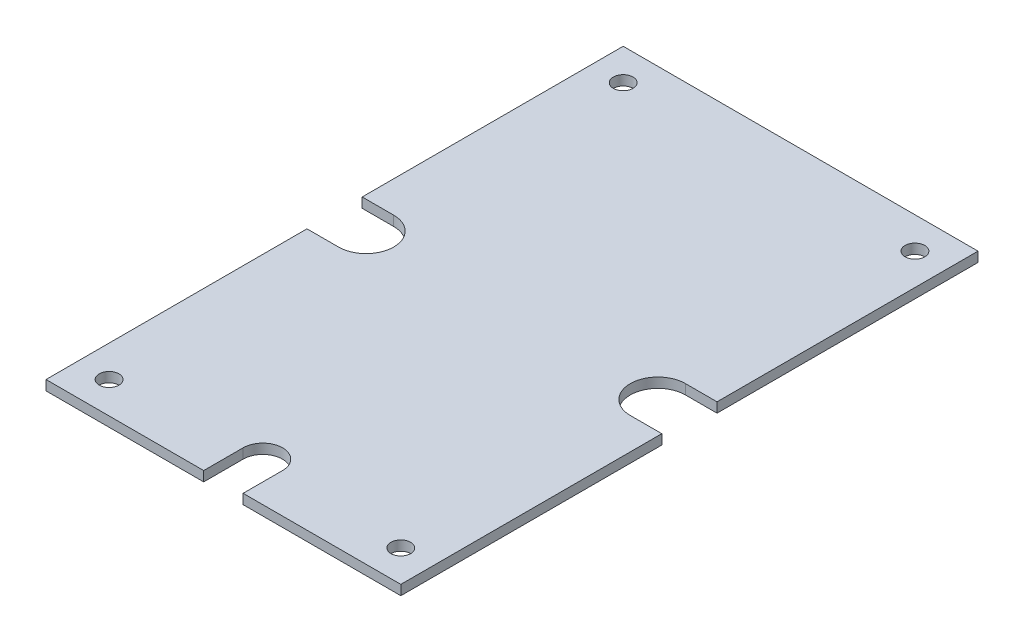
ISO-10303-21;
HEADER;
FILE_DESCRIPTION(('STEP AP214'),'2;1');
FILE_NAME('part.step','',(''),(''),'','','');
FILE_SCHEMA(('AUTOMOTIVE_DESIGN { 1 0 10303 214 1 1 1 1 }'));
ENDSEC;
DATA;
#1=APPLICATION_CONTEXT('core data for automotive mechanical design processes');
#2=APPLICATION_PROTOCOL_DEFINITION('international standard','automotive_design',2000,#1);
#3=PRODUCT_CONTEXT('',#1,'mechanical');
#4=PRODUCT('Part','Part','',(#3));
#5=PRODUCT_RELATED_PRODUCT_CATEGORY('part','',(#4));
#6=PRODUCT_DEFINITION_FORMATION('','',#4);
#7=PRODUCT_DEFINITION_CONTEXT('part definition',#1,'design');
#8=PRODUCT_DEFINITION('design','',#6,#7);
#9=PRODUCT_DEFINITION_SHAPE('','',#8);
#10=(LENGTH_UNIT() NAMED_UNIT(*) SI_UNIT(.MILLI.,.METRE.));
#11=(NAMED_UNIT(*) PLANE_ANGLE_UNIT() SI_UNIT($,.RADIAN.));
#12=(NAMED_UNIT(*) SI_UNIT($,.STERADIAN.) SOLID_ANGLE_UNIT());
#13=UNCERTAINTY_MEASURE_WITH_UNIT(LENGTH_MEASURE(1.E-05),#10,'distance_accuracy_value','');
#14=(GEOMETRIC_REPRESENTATION_CONTEXT(3) GLOBAL_UNCERTAINTY_ASSIGNED_CONTEXT((#13)) GLOBAL_UNIT_ASSIGNED_CONTEXT((#10,
#11,#12)) REPRESENTATION_CONTEXT('',''));
#15=CARTESIAN_POINT('',(0.,0.,0.));
#16=DIRECTION('',(0.,0.,1.));
#17=DIRECTION('',(1.,0.,0.));
#18=AXIS2_PLACEMENT_3D('',#15,#16,#17);
#19=CARTESIAN_POINT('',(0.,1.5875,0.));
#20=DIRECTION('',(0.,-1.,0.));
#21=DIRECTION('',(0.,0.,-1.));
#22=AXIS2_PLACEMENT_3D('',#19,#20,#21);
#23=PLANE('',#22);
#24=CARTESIAN_POINT('',(52.07,1.5875,-87.884));
#25=DIRECTION('',(0.,1.,0.));
#26=DIRECTION('',(0.,0.,1.));
#27=AXIS2_PLACEMENT_3D('',#24,#25,#26);
#28=CIRCLE('',#27,1.5875);
#29=CARTESIAN_POINT('',(52.07,1.5875,-86.2965));
#30=VERTEX_POINT('',#29);
#31=EDGE_CURVE('E259',#30,#30,#28,.T.);
#32=ORIENTED_EDGE('',*,*,#31,.F.);
#33=EDGE_LOOP('',(#32));
#34=FACE_BOUND('',#33,.T.);
#35=CARTESIAN_POINT('',(5.08,1.5875,-5.08));
#36=DIRECTION('',(0.,1.,0.));
#37=DIRECTION('',(0.,0.,1.));
#38=AXIS2_PLACEMENT_3D('',#35,#36,#37);
#39=CIRCLE('',#38,1.5875);
#40=CARTESIAN_POINT('',(5.08,1.5875,-3.4925));
#41=VERTEX_POINT('',#40);
#42=EDGE_CURVE('E266',#41,#41,#39,.T.);
#43=ORIENTED_EDGE('',*,*,#42,.F.);
#44=EDGE_LOOP('',(#43));
#45=FACE_BOUND('',#44,.T.);
#46=CARTESIAN_POINT('',(52.07,1.5875,-5.08000000000002));
#47=DIRECTION('',(0.,1.,0.));
#48=DIRECTION('',(0.,0.,1.));
#49=AXIS2_PLACEMENT_3D('',#46,#47,#48);
#50=CIRCLE('',#49,1.5875);
#51=CARTESIAN_POINT('',(52.07,1.5875,-3.49250000000002));
#52=VERTEX_POINT('',#51);
#53=EDGE_CURVE('E253',#52,#52,#50,.T.);
#54=ORIENTED_EDGE('',*,*,#53,.F.);
#55=EDGE_LOOP('',(#54));
#56=FACE_BOUND('',#55,.T.);
#57=CARTESIAN_POINT('',(5.07999999999997,1.5875,-87.884));
#58=DIRECTION('',(0.,1.,0.));
#59=DIRECTION('',(0.,0.,1.));
#60=AXIS2_PLACEMENT_3D('',#57,#58,#59);
#61=CIRCLE('',#60,1.5875);
#62=CARTESIAN_POINT('',(5.07999999999997,1.5875,-86.2965));
#63=VERTEX_POINT('',#62);
#64=EDGE_CURVE('E262',#63,#63,#61,.T.);
#65=ORIENTED_EDGE('',*,*,#64,.F.);
#66=EDGE_LOOP('',(#65));
#67=FACE_BOUND('',#66,.T.);
#68=DIRECTION('',(0.,0.,-1.));
#69=VECTOR('',#68,1.);
#70=CARTESIAN_POINT('',(25.4,1.5875,0.));
#71=LINE('',#70,#69);
#72=CARTESIAN_POINT('',(25.4,1.5875,0.));
#73=VERTEX_POINT('',#72);
#74=CARTESIAN_POINT('',(25.4,1.5875,-6.35));
#75=VERTEX_POINT('',#74);
#76=EDGE_CURVE('E152',#73,#75,#71,.T.);
#77=ORIENTED_EDGE('',*,*,#76,.T.);
#78=CARTESIAN_POINT('',(28.575,1.5875,-6.35));
#79=DIRECTION('',(0.,1.,0.));
#80=DIRECTION('',(0.,0.,1.));
#81=AXIS2_PLACEMENT_3D('',#78,#79,#80);
#82=CIRCLE('',#81,3.17500000000001);
#83=CARTESIAN_POINT('',(31.75,1.5875,-6.35));
#84=VERTEX_POINT('',#83);
#85=EDGE_CURVE('E158',#84,#75,#82,.T.);
#86=ORIENTED_EDGE('',*,*,#85,.F.);
#87=DIRECTION('',(0.,0.,1.));
#88=VECTOR('',#87,1.);
#89=CARTESIAN_POINT('',(31.75,1.5875,0.));
#90=LINE('',#89,#88);
#91=CARTESIAN_POINT('',(31.75,1.5875,0.));
#92=VERTEX_POINT('',#91);
#93=EDGE_CURVE('E526',#84,#92,#90,.T.);
#94=ORIENTED_EDGE('',*,*,#93,.T.);
#95=DIRECTION('',(1.,0.,0.));
#96=VECTOR('',#95,1.);
#97=CARTESIAN_POINT('',(0.,1.5875,0.));
#98=LINE('',#97,#96);
#99=CARTESIAN_POINT('',(57.15,1.5875,0.));
#100=VERTEX_POINT('',#99);
#101=EDGE_CURVE('E280',#92,#100,#98,.T.);
#102=ORIENTED_EDGE('',*,*,#101,.T.);
#103=DIRECTION('',(0.,0.,-1.));
#104=VECTOR('',#103,1.);
#105=CARTESIAN_POINT('',(57.15,1.5875,0.));
#106=LINE('',#105,#104);
#107=CARTESIAN_POINT('',(57.15,1.5875,-42.037));
#108=VERTEX_POINT('',#107);
#109=EDGE_CURVE('E197',#100,#108,#106,.T.);
#110=ORIENTED_EDGE('',*,*,#109,.T.);
#111=DIRECTION('',(1.,0.,0.));
#112=VECTOR('',#111,1.);
#113=CARTESIAN_POINT('',(0.,1.5875,-42.037));
#114=LINE('',#113,#112);
#115=CARTESIAN_POINT('',(52.07,1.5875,-42.037));
#116=VERTEX_POINT('',#115);
#117=EDGE_CURVE('E220',#116,#108,#114,.T.);
#118=ORIENTED_EDGE('',*,*,#117,.F.);
#119=CARTESIAN_POINT('',(52.07,1.5875,-46.482));
#120=DIRECTION('',(0.,1.,0.));
#121=DIRECTION('',(0.,0.,1.));
#122=AXIS2_PLACEMENT_3D('',#119,#120,#121);
#123=CIRCLE('',#122,4.445);
#124=CARTESIAN_POINT('',(52.07,1.5875,-50.927));
#125=VERTEX_POINT('',#124);
#126=EDGE_CURVE('E216',#125,#116,#123,.T.);
#127=ORIENTED_EDGE('',*,*,#126,.F.);
#128=DIRECTION('',(-1.,0.,0.));
#129=VECTOR('',#128,1.);
#130=CARTESIAN_POINT('',(0.,1.5875,-50.927));
#131=LINE('',#130,#129);
#132=CARTESIAN_POINT('',(57.15,1.5875,-50.927));
#133=VERTEX_POINT('',#132);
#134=EDGE_CURVE('E213',#133,#125,#131,.T.);
#135=ORIENTED_EDGE('',*,*,#134,.F.);
#136=CARTESIAN_POINT('',(57.15,1.5875,-92.964));
#137=VERTEX_POINT('',#136);
#138=EDGE_CURVE('E283',#133,#137,#106,.T.);
#139=ORIENTED_EDGE('',*,*,#138,.T.);
#140=DIRECTION('',(-1.,0.,0.));
#141=VECTOR('',#140,1.);
#142=CARTESIAN_POINT('',(0.,1.5875,-92.964));
#143=LINE('',#142,#141);
#144=CARTESIAN_POINT('',(0.,1.5875,-92.964));
#145=VERTEX_POINT('',#144);
#146=EDGE_CURVE('E187',#137,#145,#143,.T.);
#147=ORIENTED_EDGE('',*,*,#146,.T.);
#148=DIRECTION('',(0.,0.,1.));
#149=VECTOR('',#148,1.);
#150=CARTESIAN_POINT('',(0.,1.5875,0.));
#151=LINE('',#150,#149);
#152=CARTESIAN_POINT('',(0.,1.5875,-50.927));
#153=VERTEX_POINT('',#152);
#154=EDGE_CURVE('E277',#145,#153,#151,.T.);
#155=ORIENTED_EDGE('',*,*,#154,.T.);
#156=DIRECTION('',(1.,0.,0.));
#157=VECTOR('',#156,1.);
#158=CARTESIAN_POINT('',(0.,1.5875,-50.927));
#159=LINE('',#158,#157);
#160=CARTESIAN_POINT('',(5.08,1.5875,-50.927));
#161=VERTEX_POINT('',#160);
#162=EDGE_CURVE('E239',#153,#161,#159,.T.);
#163=ORIENTED_EDGE('',*,*,#162,.T.);
#164=CARTESIAN_POINT('',(5.08,1.5875,-46.482));
#165=DIRECTION('',(0.,1.,0.));
#166=DIRECTION('',(0.,0.,1.));
#167=AXIS2_PLACEMENT_3D('',#164,#165,#166);
#168=CIRCLE('',#167,4.445);
#169=CARTESIAN_POINT('',(5.08,1.5875,-42.037));
#170=VERTEX_POINT('',#169);
#171=EDGE_CURVE('E236',#161,#170,#168,.F.);
#172=ORIENTED_EDGE('',*,*,#171,.T.);
#173=DIRECTION('',(-1.,0.,0.));
#174=VECTOR('',#173,1.);
#175=CARTESIAN_POINT('',(0.,1.5875,-42.037));
#176=LINE('',#175,#174);
#177=CARTESIAN_POINT('',(0.,1.5875,-42.037));
#178=VERTEX_POINT('',#177);
#179=EDGE_CURVE('E231',#170,#178,#176,.T.);
#180=ORIENTED_EDGE('',*,*,#179,.T.);
#181=CARTESIAN_POINT('',(0.,1.5875,0.));
#182=VERTEX_POINT('',#181);
#183=EDGE_CURVE('E182',#178,#182,#151,.T.);
#184=ORIENTED_EDGE('',*,*,#183,.T.);
#185=EDGE_CURVE('E281',#182,#73,#98,.T.);
#186=ORIENTED_EDGE('',*,*,#185,.T.);
#187=EDGE_LOOP('',(#77,#86,#94,#102,#110,#118,#127,#135,#139,#147,#155,#163,#172,#180,#184,#186));
#188=FACE_BOUND('',#187,.T.);
#189=ADVANCED_FACE('F33',(#34,#45,#56,#67,#188),#23,.F.);
#190=CARTESIAN_POINT('',(0.,0.,0.));
#191=DIRECTION('',(0.,-1.,0.));
#192=DIRECTION('',(0.,0.,-1.));
#193=AXIS2_PLACEMENT_3D('',#190,#191,#192);
#194=PLANE('',#193);
#195=CARTESIAN_POINT('',(52.07,0.,-87.884));
#196=DIRECTION('',(0.,1.,0.));
#197=DIRECTION('',(0.,0.,1.));
#198=AXIS2_PLACEMENT_3D('',#195,#196,#197);
#199=CIRCLE('',#198,1.5875);
#200=CARTESIAN_POINT('',(52.07,0.,-86.2965));
#201=VERTEX_POINT('',#200);
#202=EDGE_CURVE('E263',#201,#201,#199,.T.);
#203=ORIENTED_EDGE('',*,*,#202,.T.);
#204=EDGE_LOOP('',(#203));
#205=FACE_BOUND('',#204,.T.);
#206=CARTESIAN_POINT('',(5.08,0.,-5.08));
#207=DIRECTION('',(0.,1.,0.));
#208=DIRECTION('',(0.,0.,1.));
#209=AXIS2_PLACEMENT_3D('',#206,#207,#208);
#210=CIRCLE('',#209,1.5875);
#211=CARTESIAN_POINT('',(5.08,0.,-3.4925));
#212=VERTEX_POINT('',#211);
#213=EDGE_CURVE('E256',#212,#212,#210,.T.);
#214=ORIENTED_EDGE('',*,*,#213,.T.);
#215=EDGE_LOOP('',(#214));
#216=FACE_BOUND('',#215,.T.);
#217=CARTESIAN_POINT('',(52.07,0.,-5.08000000000002));
#218=DIRECTION('',(0.,1.,0.));
#219=DIRECTION('',(0.,0.,1.));
#220=AXIS2_PLACEMENT_3D('',#217,#218,#219);
#221=CIRCLE('',#220,1.5875);
#222=CARTESIAN_POINT('',(52.07,0.,-3.49250000000002));
#223=VERTEX_POINT('',#222);
#224=EDGE_CURVE('E224',#223,#223,#221,.T.);
#225=ORIENTED_EDGE('',*,*,#224,.T.);
#226=EDGE_LOOP('',(#225));
#227=FACE_BOUND('',#226,.T.);
#228=CARTESIAN_POINT('',(5.07999999999997,0.,-87.884));
#229=DIRECTION('',(0.,1.,0.));
#230=DIRECTION('',(0.,0.,1.));
#231=AXIS2_PLACEMENT_3D('',#228,#229,#230);
#232=CIRCLE('',#231,1.5875);
#233=CARTESIAN_POINT('',(5.07999999999997,0.,-86.2965));
#234=VERTEX_POINT('',#233);
#235=EDGE_CURVE('E271',#234,#234,#232,.T.);
#236=ORIENTED_EDGE('',*,*,#235,.T.);
#237=EDGE_LOOP('',(#236));
#238=FACE_BOUND('',#237,.T.);
#239=CARTESIAN_POINT('',(28.575,0.,-6.35));
#240=DIRECTION('',(0.,-1.,0.));
#241=DIRECTION('',(0.,0.,-1.));
#242=AXIS2_PLACEMENT_3D('',#239,#240,#241);
#243=CIRCLE('',#242,3.17500000000001);
#244=CARTESIAN_POINT('',(31.75,0.,-6.35));
#245=VERTEX_POINT('',#244);
#246=CARTESIAN_POINT('',(25.4,0.,-6.35));
#247=VERTEX_POINT('',#246);
#248=EDGE_CURVE('E166',#245,#247,#243,.F.);
#249=ORIENTED_EDGE('',*,*,#248,.T.);
#250=DIRECTION('',(0.,0.,-1.));
#251=VECTOR('',#250,1.);
#252=CARTESIAN_POINT('',(25.4,0.,0.));
#253=LINE('',#252,#251);
#254=CARTESIAN_POINT('',(25.4,0.,0.));
#255=VERTEX_POINT('',#254);
#256=EDGE_CURVE('E149',#255,#247,#253,.T.);
#257=ORIENTED_EDGE('',*,*,#256,.F.);
#258=DIRECTION('',(1.,0.,0.));
#259=VECTOR('',#258,1.);
#260=CARTESIAN_POINT('',(0.,0.,0.));
#261=LINE('',#260,#259);
#262=CARTESIAN_POINT('',(0.,0.,0.));
#263=VERTEX_POINT('',#262);
#264=EDGE_CURVE('E165',#263,#255,#261,.T.);
#265=ORIENTED_EDGE('',*,*,#264,.F.);
#266=DIRECTION('',(0.,0.,1.));
#267=VECTOR('',#266,1.);
#268=CARTESIAN_POINT('',(0.,0.,0.));
#269=LINE('',#268,#267);
#270=CARTESIAN_POINT('',(0.,0.,-42.037));
#271=VERTEX_POINT('',#270);
#272=EDGE_CURVE('E274',#271,#263,#269,.T.);
#273=ORIENTED_EDGE('',*,*,#272,.F.);
#274=DIRECTION('',(-1.,0.,0.));
#275=VECTOR('',#274,1.);
#276=CARTESIAN_POINT('',(0.,0.,-42.037));
#277=LINE('',#276,#275);
#278=CARTESIAN_POINT('',(5.08,0.,-42.037));
#279=VERTEX_POINT('',#278);
#280=EDGE_CURVE('E233',#279,#271,#277,.T.);
#281=ORIENTED_EDGE('',*,*,#280,.F.);
#282=CARTESIAN_POINT('',(5.08,0.,-46.482));
#283=DIRECTION('',(0.,1.,0.));
#284=DIRECTION('',(0.,0.,1.));
#285=AXIS2_PLACEMENT_3D('',#282,#283,#284);
#286=CIRCLE('',#285,4.445);
#287=CARTESIAN_POINT('',(5.08,0.,-50.927));
#288=VERTEX_POINT('',#287);
#289=EDGE_CURVE('E228',#288,#279,#286,.F.);
#290=ORIENTED_EDGE('',*,*,#289,.F.);
#291=DIRECTION('',(1.,0.,0.));
#292=VECTOR('',#291,1.);
#293=CARTESIAN_POINT('',(0.,0.,-50.927));
#294=LINE('',#293,#292);
#295=CARTESIAN_POINT('',(0.,0.,-50.927));
#296=VERTEX_POINT('',#295);
#297=EDGE_CURVE('E230',#296,#288,#294,.T.);
#298=ORIENTED_EDGE('',*,*,#297,.F.);
#299=CARTESIAN_POINT('',(0.,0.,-92.964));
#300=VERTEX_POINT('',#299);
#301=EDGE_CURVE('E175',#300,#296,#269,.T.);
#302=ORIENTED_EDGE('',*,*,#301,.F.);
#303=DIRECTION('',(-1.,0.,0.));
#304=VECTOR('',#303,1.);
#305=CARTESIAN_POINT('',(0.,0.,-92.964));
#306=LINE('',#305,#304);
#307=CARTESIAN_POINT('',(57.15,0.,-92.964));
#308=VERTEX_POINT('',#307);
#309=EDGE_CURVE('E180',#308,#300,#306,.T.);
#310=ORIENTED_EDGE('',*,*,#309,.F.);
#311=DIRECTION('',(0.,0.,-1.));
#312=VECTOR('',#311,1.);
#313=CARTESIAN_POINT('',(57.15,0.,0.));
#314=LINE('',#313,#312);
#315=CARTESIAN_POINT('',(57.15,0.,-50.927));
#316=VERTEX_POINT('',#315);
#317=EDGE_CURVE('E170',#316,#308,#314,.T.);
#318=ORIENTED_EDGE('',*,*,#317,.F.);
#319=DIRECTION('',(-1.,0.,0.));
#320=VECTOR('',#319,1.);
#321=CARTESIAN_POINT('',(0.,0.,-50.927));
#322=LINE('',#321,#320);
#323=CARTESIAN_POINT('',(52.07,0.,-50.927));
#324=VERTEX_POINT('',#323);
#325=EDGE_CURVE('E209',#316,#324,#322,.T.);
#326=ORIENTED_EDGE('',*,*,#325,.T.);
#327=CARTESIAN_POINT('',(52.07,0.,-46.482));
#328=DIRECTION('',(0.,1.,0.));
#329=DIRECTION('',(0.,0.,1.));
#330=AXIS2_PLACEMENT_3D('',#327,#328,#329);
#331=CIRCLE('',#330,4.445);
#332=CARTESIAN_POINT('',(52.07,0.,-42.037));
#333=VERTEX_POINT('',#332);
#334=EDGE_CURVE('E204',#324,#333,#331,.T.);
#335=ORIENTED_EDGE('',*,*,#334,.T.);
#336=DIRECTION('',(1.,0.,0.));
#337=VECTOR('',#336,1.);
#338=CARTESIAN_POINT('',(0.,0.,-42.037));
#339=LINE('',#338,#337);
#340=CARTESIAN_POINT('',(57.15,0.,-42.037));
#341=VERTEX_POINT('',#340);
#342=EDGE_CURVE('E56',#333,#341,#339,.T.);
#343=ORIENTED_EDGE('',*,*,#342,.T.);
#344=CARTESIAN_POINT('',(57.15,0.,0.));
#345=VERTEX_POINT('',#344);
#346=EDGE_CURVE('E173',#345,#341,#314,.T.);
#347=ORIENTED_EDGE('',*,*,#346,.F.);
#348=CARTESIAN_POINT('',(31.75,0.,0.));
#349=VERTEX_POINT('',#348);
#350=EDGE_CURVE('E171',#349,#345,#261,.T.);
#351=ORIENTED_EDGE('',*,*,#350,.F.);
#352=DIRECTION('',(0.,0.,1.));
#353=VECTOR('',#352,1.);
#354=CARTESIAN_POINT('',(31.75,0.,0.));
#355=LINE('',#354,#353);
#356=EDGE_CURVE('E48',#245,#349,#355,.T.);
#357=ORIENTED_EDGE('',*,*,#356,.F.);
#358=EDGE_LOOP('',(#249,#257,#265,#273,#281,#290,#298,#302,#310,#318,#326,#335,#343,#347,#351,#357));
#359=FACE_BOUND('',#358,.T.);
#360=ADVANCED_FACE('F163',(#205,#216,#227,#238,#359),#194,.T.);
#361=CARTESIAN_POINT('',(0.,1.5875,0.));
#362=DIRECTION('',(0.,0.,-1.));
#363=DIRECTION('',(-1.,0.,0.));
#364=AXIS2_PLACEMENT_3D('',#361,#362,#363);
#365=PLANE('',#364);
#366=DIRECTION('',(0.,1.,0.));
#367=VECTOR('',#366,1.);
#368=CARTESIAN_POINT('',(25.4,-0.000999999999999916,0.));
#369=LINE('',#368,#367);
#370=EDGE_CURVE('E146',#255,#73,#369,.T.);
#371=ORIENTED_EDGE('',*,*,#370,.T.);
#372=ORIENTED_EDGE('',*,*,#185,.F.);
#373=DIRECTION('',(0.,-1.,0.));
#374=VECTOR('',#373,1.);
#375=CARTESIAN_POINT('',(0.,1.5875,0.));
#376=LINE('',#375,#374);
#377=EDGE_CURVE('E11',#182,#263,#376,.T.);
#378=ORIENTED_EDGE('',*,*,#377,.T.);
#379=ORIENTED_EDGE('',*,*,#264,.T.);
#380=EDGE_LOOP('',(#371,#372,#378,#379));
#381=FACE_BOUND('',#380,.T.);
#382=ADVANCED_FACE('F168',(#381),#365,.F.);
#383=DIRECTION('',(0.,1.,0.));
#384=VECTOR('',#383,1.);
#385=CARTESIAN_POINT('',(31.75,-0.000999999999999916,0.));
#386=LINE('',#385,#384);
#387=EDGE_CURVE('E157',#349,#92,#386,.T.);
#388=ORIENTED_EDGE('',*,*,#387,.F.);
#389=ORIENTED_EDGE('',*,*,#350,.T.);
#390=DIRECTION('',(0.,-1.,0.));
#391=VECTOR('',#390,1.);
#392=CARTESIAN_POINT('',(57.15,1.5875,0.));
#393=LINE('',#392,#391);
#394=EDGE_CURVE('E41',#100,#345,#393,.T.);
#395=ORIENTED_EDGE('',*,*,#394,.F.);
#396=ORIENTED_EDGE('',*,*,#101,.F.);
#397=EDGE_LOOP('',(#388,#389,#395,#396));
#398=FACE_BOUND('',#397,.T.);
#399=ADVANCED_FACE('F314',(#398),#365,.F.);
#400=CARTESIAN_POINT('',(0.,1.5875,0.));
#401=DIRECTION('',(1.,0.,0.));
#402=DIRECTION('',(0.,0.,-1.));
#403=AXIS2_PLACEMENT_3D('',#400,#401,#402);
#404=PLANE('',#403);
#405=DIRECTION('',(0.,1.,0.));
#406=VECTOR('',#405,1.);
#407=CARTESIAN_POINT('',(0.,0.,-42.037));
#408=LINE('',#407,#406);
#409=EDGE_CURVE('E247',#271,#178,#408,.T.);
#410=ORIENTED_EDGE('',*,*,#409,.F.);
#411=ORIENTED_EDGE('',*,*,#272,.T.);
#412=ORIENTED_EDGE('',*,*,#377,.F.);
#413=ORIENTED_EDGE('',*,*,#183,.F.);
#414=EDGE_LOOP('',(#410,#411,#412,#413));
#415=FACE_BOUND('',#414,.T.);
#416=ADVANCED_FACE('F35',(#415),#404,.F.);
#417=DIRECTION('',(0.,1.,0.));
#418=VECTOR('',#417,1.);
#419=CARTESIAN_POINT('',(0.,0.,-50.927));
#420=LINE('',#419,#418);
#421=EDGE_CURVE('E249',#296,#153,#420,.T.);
#422=ORIENTED_EDGE('',*,*,#421,.T.);
#423=ORIENTED_EDGE('',*,*,#154,.F.);
#424=DIRECTION('',(0.,-1.,0.));
#425=VECTOR('',#424,1.);
#426=CARTESIAN_POINT('',(0.,1.5875,-92.964));
#427=LINE('',#426,#425);
#428=EDGE_CURVE('E183',#145,#300,#427,.T.);
#429=ORIENTED_EDGE('',*,*,#428,.T.);
#430=ORIENTED_EDGE('',*,*,#301,.T.);
#431=EDGE_LOOP('',(#422,#423,#429,#430));
#432=FACE_BOUND('',#431,.T.);
#433=ADVANCED_FACE('F297',(#432),#404,.F.);
#434=CARTESIAN_POINT('',(57.15,1.5875,0.));
#435=DIRECTION('',(-1.,0.,0.));
#436=DIRECTION('',(0.,0.,1.));
#437=AXIS2_PLACEMENT_3D('',#434,#435,#436);
#438=PLANE('',#437);
#439=ORIENTED_EDGE('',*,*,#138,.F.);
#440=DIRECTION('',(0.,1.,0.));
#441=VECTOR('',#440,1.);
#442=CARTESIAN_POINT('',(57.15,0.,-50.927));
#443=LINE('',#442,#441);
#444=EDGE_CURVE('E222',#316,#133,#443,.T.);
#445=ORIENTED_EDGE('',*,*,#444,.F.);
#446=ORIENTED_EDGE('',*,*,#317,.T.);
#447=DIRECTION('',(0.,-1.,0.));
#448=VECTOR('',#447,1.);
#449=CARTESIAN_POINT('',(57.15,1.5875,-92.964));
#450=LINE('',#449,#448);
#451=EDGE_CURVE('E186',#137,#308,#450,.T.);
#452=ORIENTED_EDGE('',*,*,#451,.F.);
#453=EDGE_LOOP('',(#439,#445,#446,#452));
#454=FACE_BOUND('',#453,.T.);
#455=ADVANCED_FACE('F318',(#454),#438,.F.);
#456=ORIENTED_EDGE('',*,*,#346,.T.);
#457=DIRECTION('',(0.,1.,0.));
#458=VECTOR('',#457,1.);
#459=CARTESIAN_POINT('',(57.15,0.,-42.037));
#460=LINE('',#459,#458);
#461=EDGE_CURVE('E225',#341,#108,#460,.T.);
#462=ORIENTED_EDGE('',*,*,#461,.T.);
#463=ORIENTED_EDGE('',*,*,#109,.F.);
#464=ORIENTED_EDGE('',*,*,#394,.T.);
#465=EDGE_LOOP('',(#456,#462,#463,#464));
#466=FACE_BOUND('',#465,.T.);
#467=ADVANCED_FACE('F194',(#466),#438,.F.);
#468=CARTESIAN_POINT('',(0.,1.5875,-92.964));
#469=DIRECTION('',(0.,0.,1.));
#470=DIRECTION('',(1.,0.,0.));
#471=AXIS2_PLACEMENT_3D('',#468,#469,#470);
#472=PLANE('',#471);
#473=ORIENTED_EDGE('',*,*,#309,.T.);
#474=ORIENTED_EDGE('',*,*,#428,.F.);
#475=ORIENTED_EDGE('',*,*,#146,.F.);
#476=ORIENTED_EDGE('',*,*,#451,.T.);
#477=EDGE_LOOP('',(#473,#474,#475,#476));
#478=FACE_BOUND('',#477,.T.);
#479=ADVANCED_FACE('F292',(#478),#472,.F.);
#480=CARTESIAN_POINT('',(5.07999999999997,0.,-87.884));
#481=DIRECTION('',(0.,1.,0.));
#482=DIRECTION('',(0.,0.,1.));
#483=AXIS2_PLACEMENT_3D('',#480,#481,#482);
#484=CYLINDRICAL_SURFACE('',#483,1.5875);
#485=ORIENTED_EDGE('',*,*,#235,.F.);
#486=EDGE_LOOP('',(#485));
#487=FACE_BOUND('',#486,.T.);
#488=ORIENTED_EDGE('',*,*,#64,.T.);
#489=EDGE_LOOP('',(#488));
#490=FACE_BOUND('',#489,.T.);
#491=ADVANCED_FACE('F332',(#487,#490),#484,.F.);
#492=CARTESIAN_POINT('',(52.07,0.,-5.08000000000002));
#493=DIRECTION('',(0.,1.,0.));
#494=DIRECTION('',(0.,0.,1.));
#495=AXIS2_PLACEMENT_3D('',#492,#493,#494);
#496=CYLINDRICAL_SURFACE('',#495,1.5875);
#497=ORIENTED_EDGE('',*,*,#224,.F.);
#498=EDGE_LOOP('',(#497));
#499=FACE_BOUND('',#498,.T.);
#500=ORIENTED_EDGE('',*,*,#53,.T.);
#501=EDGE_LOOP('',(#500));
#502=FACE_BOUND('',#501,.T.);
#503=ADVANCED_FACE('F399',(#499,#502),#496,.F.);
#504=CARTESIAN_POINT('',(5.08,0.,-5.08));
#505=DIRECTION('',(0.,1.,0.));
#506=DIRECTION('',(0.,0.,1.));
#507=AXIS2_PLACEMENT_3D('',#504,#505,#506);
#508=CYLINDRICAL_SURFACE('',#507,1.5875);
#509=ORIENTED_EDGE('',*,*,#213,.F.);
#510=EDGE_LOOP('',(#509));
#511=FACE_BOUND('',#510,.T.);
#512=ORIENTED_EDGE('',*,*,#42,.T.);
#513=EDGE_LOOP('',(#512));
#514=FACE_BOUND('',#513,.T.);
#515=ADVANCED_FACE('F402',(#511,#514),#508,.F.);
#516=CARTESIAN_POINT('',(52.07,0.,-87.884));
#517=DIRECTION('',(0.,1.,0.));
#518=DIRECTION('',(0.,0.,1.));
#519=AXIS2_PLACEMENT_3D('',#516,#517,#518);
#520=CYLINDRICAL_SURFACE('',#519,1.5875);
#521=ORIENTED_EDGE('',*,*,#202,.F.);
#522=EDGE_LOOP('',(#521));
#523=FACE_BOUND('',#522,.T.);
#524=ORIENTED_EDGE('',*,*,#31,.T.);
#525=EDGE_LOOP('',(#524));
#526=FACE_BOUND('',#525,.T.);
#527=ADVANCED_FACE('F398',(#523,#526),#520,.F.);
#528=CARTESIAN_POINT('',(5.08,0.,-46.482));
#529=DIRECTION('',(0.,1.,0.));
#530=DIRECTION('',(0.,0.,1.));
#531=AXIS2_PLACEMENT_3D('',#528,#529,#530);
#532=CYLINDRICAL_SURFACE('',#531,4.445);
#533=ORIENTED_EDGE('',*,*,#171,.F.);
#534=DIRECTION('',(0.,1.,0.));
#535=VECTOR('',#534,1.);
#536=CARTESIAN_POINT('',(5.08,0.,-50.927));
#537=LINE('',#536,#535);
#538=EDGE_CURVE('E235',#288,#161,#537,.T.);
#539=ORIENTED_EDGE('',*,*,#538,.F.);
#540=ORIENTED_EDGE('',*,*,#289,.T.);
#541=DIRECTION('',(0.,1.,0.));
#542=VECTOR('',#541,1.);
#543=CARTESIAN_POINT('',(5.08,0.,-42.037));
#544=LINE('',#543,#542);
#545=EDGE_CURVE('E217',#279,#170,#544,.T.);
#546=ORIENTED_EDGE('',*,*,#545,.T.);
#547=EDGE_LOOP('',(#533,#539,#540,#546));
#548=FACE_BOUND('',#547,.T.);
#549=ADVANCED_FACE('F307',(#548),#532,.F.);
#550=CARTESIAN_POINT('',(0.,0.,-42.037));
#551=DIRECTION('',(0.,0.,-1.));
#552=DIRECTION('',(-1.,0.,0.));
#553=AXIS2_PLACEMENT_3D('',#550,#551,#552);
#554=PLANE('',#553);
#555=ORIENTED_EDGE('',*,*,#179,.F.);
#556=ORIENTED_EDGE('',*,*,#545,.F.);
#557=ORIENTED_EDGE('',*,*,#280,.T.);
#558=ORIENTED_EDGE('',*,*,#409,.T.);
#559=EDGE_LOOP('',(#555,#556,#557,#558));
#560=FACE_BOUND('',#559,.T.);
#561=ADVANCED_FACE('F309',(#560),#554,.T.);
#562=CARTESIAN_POINT('',(0.,0.,-50.927));
#563=DIRECTION('',(0.,0.,1.));
#564=DIRECTION('',(1.,0.,0.));
#565=AXIS2_PLACEMENT_3D('',#562,#563,#564);
#566=PLANE('',#565);
#567=ORIENTED_EDGE('',*,*,#162,.F.);
#568=ORIENTED_EDGE('',*,*,#421,.F.);
#569=ORIENTED_EDGE('',*,*,#297,.T.);
#570=ORIENTED_EDGE('',*,*,#538,.T.);
#571=EDGE_LOOP('',(#567,#568,#569,#570));
#572=FACE_BOUND('',#571,.T.);
#573=ADVANCED_FACE('F300',(#572),#566,.T.);
#574=CARTESIAN_POINT('',(0.,0.,-50.927));
#575=DIRECTION('',(0.,0.,-1.));
#576=DIRECTION('',(-1.,0.,0.));
#577=AXIS2_PLACEMENT_3D('',#574,#575,#576);
#578=PLANE('',#577);
#579=ORIENTED_EDGE('',*,*,#134,.T.);
#580=DIRECTION('',(0.,1.,0.));
#581=VECTOR('',#580,1.);
#582=CARTESIAN_POINT('',(52.07,0.,-50.927));
#583=LINE('',#582,#581);
#584=EDGE_CURVE('E205',#324,#125,#583,.T.);
#585=ORIENTED_EDGE('',*,*,#584,.F.);
#586=ORIENTED_EDGE('',*,*,#325,.F.);
#587=ORIENTED_EDGE('',*,*,#444,.T.);
#588=EDGE_LOOP('',(#579,#585,#586,#587));
#589=FACE_BOUND('',#588,.T.);
#590=ADVANCED_FACE('F385',(#589),#578,.F.);
#591=CARTESIAN_POINT('',(0.,0.,-42.037));
#592=DIRECTION('',(0.,0.,1.));
#593=DIRECTION('',(1.,0.,0.));
#594=AXIS2_PLACEMENT_3D('',#591,#592,#593);
#595=PLANE('',#594);
#596=ORIENTED_EDGE('',*,*,#117,.T.);
#597=ORIENTED_EDGE('',*,*,#461,.F.);
#598=ORIENTED_EDGE('',*,*,#342,.F.);
#599=DIRECTION('',(0.,1.,0.));
#600=VECTOR('',#599,1.);
#601=CARTESIAN_POINT('',(52.07,0.,-42.037));
#602=LINE('',#601,#600);
#603=EDGE_CURVE('E207',#333,#116,#602,.T.);
#604=ORIENTED_EDGE('',*,*,#603,.T.);
#605=EDGE_LOOP('',(#596,#597,#598,#604));
#606=FACE_BOUND('',#605,.T.);
#607=ADVANCED_FACE('F382',(#606),#595,.F.);
#608=CARTESIAN_POINT('',(52.07,0.,-46.482));
#609=DIRECTION('',(0.,1.,0.));
#610=DIRECTION('',(0.,0.,1.));
#611=AXIS2_PLACEMENT_3D('',#608,#609,#610);
#612=CYLINDRICAL_SURFACE('',#611,4.445);
#613=ORIENTED_EDGE('',*,*,#126,.T.);
#614=ORIENTED_EDGE('',*,*,#603,.F.);
#615=ORIENTED_EDGE('',*,*,#334,.F.);
#616=ORIENTED_EDGE('',*,*,#584,.T.);
#617=EDGE_LOOP('',(#613,#614,#615,#616));
#618=FACE_BOUND('',#617,.T.);
#619=ADVANCED_FACE('F358',(#618),#612,.F.);
#620=CARTESIAN_POINT('',(25.4,-0.000999999999999916,0.));
#621=DIRECTION('',(1.,0.,0.));
#622=DIRECTION('',(0.,0.,-1.));
#623=AXIS2_PLACEMENT_3D('',#620,#621,#622);
#624=PLANE('',#623);
#625=ORIENTED_EDGE('',*,*,#256,.T.);
#626=DIRECTION('',(0.,1.,0.));
#627=VECTOR('',#626,1.);
#628=CARTESIAN_POINT('',(25.4,-0.000999999999999916,-6.35));
#629=LINE('',#628,#627);
#630=EDGE_CURVE('E240',#247,#75,#629,.T.);
#631=ORIENTED_EDGE('',*,*,#630,.T.);
#632=ORIENTED_EDGE('',*,*,#76,.F.);
#633=ORIENTED_EDGE('',*,*,#370,.F.);
#634=EDGE_LOOP('',(#625,#631,#632,#633));
#635=FACE_BOUND('',#634,.T.);
#636=ADVANCED_FACE('F148',(#635),#624,.T.);
#637=CARTESIAN_POINT('',(28.575,-0.000999999999999916,-6.35));
#638=DIRECTION('',(0.,1.,0.));
#639=DIRECTION('',(0.,0.,1.));
#640=AXIS2_PLACEMENT_3D('',#637,#638,#639);
#641=CYLINDRICAL_SURFACE('',#640,3.17500000000001);
#642=DIRECTION('',(0.,1.,0.));
#643=VECTOR('',#642,1.);
#644=CARTESIAN_POINT('',(31.75,-0.000999999999999916,-6.35));
#645=LINE('',#644,#643);
#646=EDGE_CURVE('E521',#245,#84,#645,.T.);
#647=ORIENTED_EDGE('',*,*,#646,.T.);
#648=ORIENTED_EDGE('',*,*,#85,.T.);
#649=ORIENTED_EDGE('',*,*,#630,.F.);
#650=ORIENTED_EDGE('',*,*,#248,.F.);
#651=EDGE_LOOP('',(#647,#648,#649,#650));
#652=FACE_BOUND('',#651,.T.);
#653=ADVANCED_FACE('F357',(#652),#641,.F.);
#654=CARTESIAN_POINT('',(31.75,-0.000999999999999916,0.));
#655=DIRECTION('',(-1.,0.,0.));
#656=DIRECTION('',(0.,0.,1.));
#657=AXIS2_PLACEMENT_3D('',#654,#655,#656);
#658=PLANE('',#657);
#659=ORIENTED_EDGE('',*,*,#356,.T.);
#660=ORIENTED_EDGE('',*,*,#387,.T.);
#661=ORIENTED_EDGE('',*,*,#93,.F.);
#662=ORIENTED_EDGE('',*,*,#646,.F.);
#663=EDGE_LOOP('',(#659,#660,#661,#662));
#664=FACE_BOUND('',#663,.T.);
#665=ADVANCED_FACE('F368',(#664),#658,.T.);
#666=CLOSED_SHELL('',(#189,#360,#382,#399,#416,#433,#455,#467,#479,#491,#503,#515,#527,#549,
#561,#573,#590,#607,#619,#636,#653,#665));
#667=MANIFOLD_SOLID_BREP('B2',#666);
#668=ADVANCED_BREP_SHAPE_REPRESENTATION('',(#18,#667),#14);
#669=SHAPE_DEFINITION_REPRESENTATION(#9,#668);
ENDSEC;
END-ISO-10303-21;
